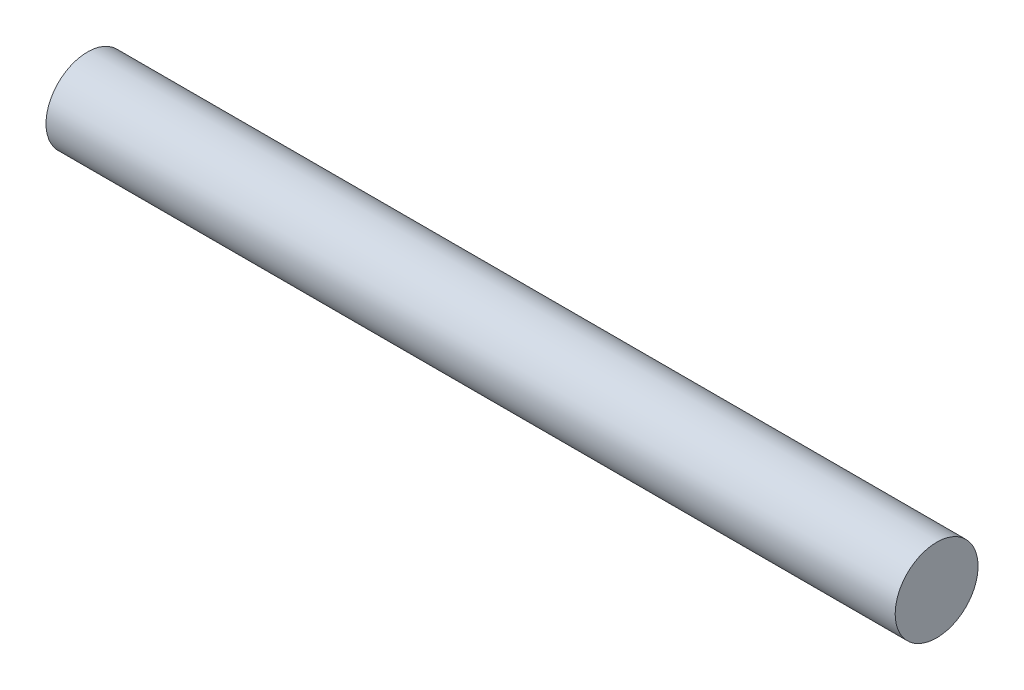
ISO-10303-21;
HEADER;
FILE_DESCRIPTION(('STEP AP214'),'2;1');
FILE_NAME('part.step','',(''),(''),'','','');
FILE_SCHEMA(('AUTOMOTIVE_DESIGN { 1 0 10303 214 1 1 1 1 }'));
ENDSEC;
DATA;
#1=APPLICATION_CONTEXT('core data for automotive mechanical design processes');
#2=APPLICATION_PROTOCOL_DEFINITION('international standard','automotive_design',2000,#1);
#3=PRODUCT_CONTEXT('',#1,'mechanical');
#4=PRODUCT('Part','Part','',(#3));
#5=PRODUCT_RELATED_PRODUCT_CATEGORY('part','',(#4));
#6=PRODUCT_DEFINITION_FORMATION('','',#4);
#7=PRODUCT_DEFINITION_CONTEXT('part definition',#1,'design');
#8=PRODUCT_DEFINITION('design','',#6,#7);
#9=PRODUCT_DEFINITION_SHAPE('','',#8);
#10=(LENGTH_UNIT() NAMED_UNIT(*) SI_UNIT(.MILLI.,.METRE.));
#11=(NAMED_UNIT(*) PLANE_ANGLE_UNIT() SI_UNIT($,.RADIAN.));
#12=(NAMED_UNIT(*) SI_UNIT($,.STERADIAN.) SOLID_ANGLE_UNIT());
#13=UNCERTAINTY_MEASURE_WITH_UNIT(LENGTH_MEASURE(1.E-05),#10,'distance_accuracy_value','');
#14=(GEOMETRIC_REPRESENTATION_CONTEXT(3) GLOBAL_UNCERTAINTY_ASSIGNED_CONTEXT((#13)) GLOBAL_UNIT_ASSIGNED_CONTEXT((#10,
#11,#12)) REPRESENTATION_CONTEXT('',''));
#15=CARTESIAN_POINT('',(0.,0.,0.));
#16=DIRECTION('',(0.,0.,1.));
#17=DIRECTION('',(1.,0.,0.));
#18=AXIS2_PLACEMENT_3D('',#15,#16,#17);
#19=CARTESIAN_POINT('',(30.73,0.,0.));
#20=DIRECTION('',(-1.,0.,0.));
#21=DIRECTION('',(0.,0.,1.));
#22=AXIS2_PLACEMENT_3D('',#19,#20,#21);
#23=CYLINDRICAL_SURFACE('',#22,1.5);
#24=CARTESIAN_POINT('',(30.73,0.,0.));
#25=DIRECTION('',(1.,0.,0.));
#26=DIRECTION('',(0.,0.,-1.));
#27=AXIS2_PLACEMENT_3D('',#24,#25,#26);
#28=CIRCLE('',#27,1.5);
#29=CARTESIAN_POINT('',(30.73,0.,1.5));
#30=VERTEX_POINT('',#29);
#31=EDGE_CURVE('E10',#30,#30,#28,.T.);
#32=CARTESIAN_POINT('',(0.,0.,0.));
#33=DIRECTION('',(1.,0.,0.));
#34=DIRECTION('',(0.,0.,-1.));
#35=AXIS2_PLACEMENT_3D('',#32,#33,#34);
#36=CIRCLE('',#35,1.5);
#37=CARTESIAN_POINT('',(0.,0.,1.5));
#38=VERTEX_POINT('',#37);
#39=EDGE_CURVE('E34',#38,#38,#36,.T.);
#40=CARTESIAN_POINT('',(30.73,0.,1.5));
#41=CARTESIAN_POINT('',(30.4098958333333,0.,1.5));
#42=CARTESIAN_POINT('',(30.0897916666667,0.,1.5));
#43=CARTESIAN_POINT('',(29.4495833333333,0.,1.5));
#44=CARTESIAN_POINT('',(29.1294791666667,0.,1.5));
#45=CARTESIAN_POINT('',(28.4892708333333,0.,1.5));
#46=CARTESIAN_POINT('',(28.1691666666667,0.,1.5));
#47=CARTESIAN_POINT('',(27.5289583333333,0.,1.5));
#48=CARTESIAN_POINT('',(27.2088541666667,0.,1.5));
#49=CARTESIAN_POINT('',(26.5686458333333,0.,1.5));
#50=CARTESIAN_POINT('',(26.2485416666667,0.,1.5));
#51=CARTESIAN_POINT('',(25.6083333333333,0.,1.5));
#52=CARTESIAN_POINT('',(25.2882291666667,0.,1.5));
#53=CARTESIAN_POINT('',(24.6480208333333,0.,1.5));
#54=CARTESIAN_POINT('',(24.3279166666667,0.,1.5));
#55=CARTESIAN_POINT('',(23.6877083333333,0.,1.5));
#56=CARTESIAN_POINT('',(23.3676041666667,0.,1.5));
#57=CARTESIAN_POINT('',(22.7273958333333,0.,1.5));
#58=CARTESIAN_POINT('',(22.4072916666667,0.,1.5));
#59=CARTESIAN_POINT('',(21.7670833333333,0.,1.5));
#60=CARTESIAN_POINT('',(21.4469791666667,0.,1.5));
#61=CARTESIAN_POINT('',(20.8067708333333,0.,1.5));
#62=CARTESIAN_POINT('',(20.4866666666667,0.,1.5));
#63=CARTESIAN_POINT('',(19.8464583333333,0.,1.5));
#64=CARTESIAN_POINT('',(19.5263541666667,0.,1.5));
#65=CARTESIAN_POINT('',(18.8861458333333,0.,1.5));
#66=CARTESIAN_POINT('',(18.5660416666667,0.,1.5));
#67=CARTESIAN_POINT('',(17.9258333333333,0.,1.5));
#68=CARTESIAN_POINT('',(17.6057291666667,0.,1.5));
#69=CARTESIAN_POINT('',(16.9655208333333,0.,1.5));
#70=CARTESIAN_POINT('',(16.6454166666667,0.,1.5));
#71=CARTESIAN_POINT('',(16.0052083333333,0.,1.5));
#72=CARTESIAN_POINT('',(15.6851041666667,0.,1.5));
#73=CARTESIAN_POINT('',(15.0448958333333,0.,1.5));
#74=CARTESIAN_POINT('',(14.7247916666667,0.,1.5));
#75=CARTESIAN_POINT('',(14.0845833333333,0.,1.5));
#76=CARTESIAN_POINT('',(13.7644791666667,0.,1.5));
#77=CARTESIAN_POINT('',(13.1242708333333,0.,1.5));
#78=CARTESIAN_POINT('',(12.8041666666667,0.,1.5));
#79=CARTESIAN_POINT('',(12.1639583333333,0.,1.5));
#80=CARTESIAN_POINT('',(11.8438541666667,0.,1.5));
#81=CARTESIAN_POINT('',(11.2036458333333,0.,1.5));
#82=CARTESIAN_POINT('',(10.8835416666667,0.,1.5));
#83=CARTESIAN_POINT('',(10.2433333333333,0.,1.5));
#84=CARTESIAN_POINT('',(9.92322916666667,0.,1.5));
#85=CARTESIAN_POINT('',(9.28302083333333,0.,1.5));
#86=CARTESIAN_POINT('',(8.96291666666667,0.,1.5));
#87=CARTESIAN_POINT('',(8.32270833333333,0.,1.5));
#88=CARTESIAN_POINT('',(8.00260416666666,0.,1.5));
#89=CARTESIAN_POINT('',(7.36239583333333,0.,1.5));
#90=CARTESIAN_POINT('',(7.04229166666666,0.,1.5));
#91=CARTESIAN_POINT('',(6.40208333333333,0.,1.5));
#92=CARTESIAN_POINT('',(6.08197916666666,0.,1.5));
#93=CARTESIAN_POINT('',(5.44177083333333,0.,1.5));
#94=CARTESIAN_POINT('',(5.12166666666666,0.,1.5));
#95=CARTESIAN_POINT('',(4.48145833333333,0.,1.5));
#96=CARTESIAN_POINT('',(4.16135416666666,0.,1.5));
#97=CARTESIAN_POINT('',(3.52114583333333,0.,1.5));
#98=CARTESIAN_POINT('',(3.20104166666666,0.,1.5));
#99=CARTESIAN_POINT('',(2.56083333333333,0.,1.5));
#100=CARTESIAN_POINT('',(2.24072916666666,0.,1.5));
#101=CARTESIAN_POINT('',(1.60052083333333,0.,1.5));
#102=CARTESIAN_POINT('',(1.28041666666666,0.,1.5));
#103=CARTESIAN_POINT('',(0.640208333333331,0.,1.5));
#104=CARTESIAN_POINT('',(0.320104166666664,0.,1.5));
#105=CARTESIAN_POINT('',(0.,0.,1.5));
#106=B_SPLINE_CURVE_WITH_KNOTS('',3,(#40,#41,#42,#43,#44,#45,#46,#47,#48,#49,#50,#51,#52,#53,
#54,#55,#56,#57,#58,#59,#60,#61,#62,#63,#64,#65,#66,#67,#68,#69,#70,#71,#72,#73,#74,#75,#76,#77,
#78,#79,#80,#81,#82,#83,#84,#85,#86,#87,#88,#89,#90,#91,#92,#93,#94,#95,#96,#97,#98,#99,#100,
#101,#102,#103,#104,#105),.UNSPECIFIED.,.F.,.F.,(4,2,2,2,2,2,2,2,2,2,2,2,2,2,2,2,2,2,2,2,2,2,2,
2,2,2,2,2,2,2,2,2,4),(0.,0.960312500000001,1.920625,2.8809375,3.84125,4.8015625,5.761875,
6.7221875,7.6825,8.6428125,9.603125,10.5634375,11.52375,12.4840625,13.444375,14.4046875,15.365,
16.3253125,17.285625,18.2459375,19.20625,20.1665625,21.126875,22.0871875,23.0475,24.0078125,
24.968125,25.9284375,26.88875,27.8490625,28.809375,29.7696875,30.73),.UNSPECIFIED.);
#107=EDGE_CURVE('BSEAM31',#30,#38,#106,.T.);
#108=ORIENTED_EDGE('',*,*,#31,.F.);
#109=ORIENTED_EDGE('',*,*,#39,.T.);
#110=ORIENTED_EDGE('',*,*,#107,.T.);
#111=ORIENTED_EDGE('',*,*,#107,.F.);
#112=EDGE_LOOP('',(#108,#110,#109,#111));
#113=FACE_BOUND('',#112,.T.);
#114=ADVANCED_FACE('F31',(#113),#23,.T.);
#115=CARTESIAN_POINT('',(30.73,0.,0.));
#116=DIRECTION('',(1.,0.,0.));
#117=DIRECTION('',(0.,0.,-1.));
#118=AXIS2_PLACEMENT_3D('',#115,#116,#117);
#119=PLANE('',#118);
#120=ORIENTED_EDGE('',*,*,#31,.T.);
#121=EDGE_LOOP('',(#120));
#122=FACE_BOUND('',#121,.T.);
#123=ADVANCED_FACE('F46',(#122),#119,.T.);
#124=CARTESIAN_POINT('',(0.,0.,0.));
#125=DIRECTION('',(1.,0.,0.));
#126=DIRECTION('',(0.,0.,-1.));
#127=AXIS2_PLACEMENT_3D('',#124,#125,#126);
#128=PLANE('',#127);
#129=ORIENTED_EDGE('',*,*,#39,.F.);
#130=EDGE_LOOP('',(#129));
#131=FACE_BOUND('',#130,.T.);
#132=ADVANCED_FACE('F44',(#131),#128,.F.);
#133=CLOSED_SHELL('',(#114,#123,#132));
#134=MANIFOLD_SOLID_BREP('B2',#133);
#135=ADVANCED_BREP_SHAPE_REPRESENTATION('',(#18,#134),#14);
#136=SHAPE_DEFINITION_REPRESENTATION(#9,#135);
ENDSEC;
END-ISO-10303-21;
